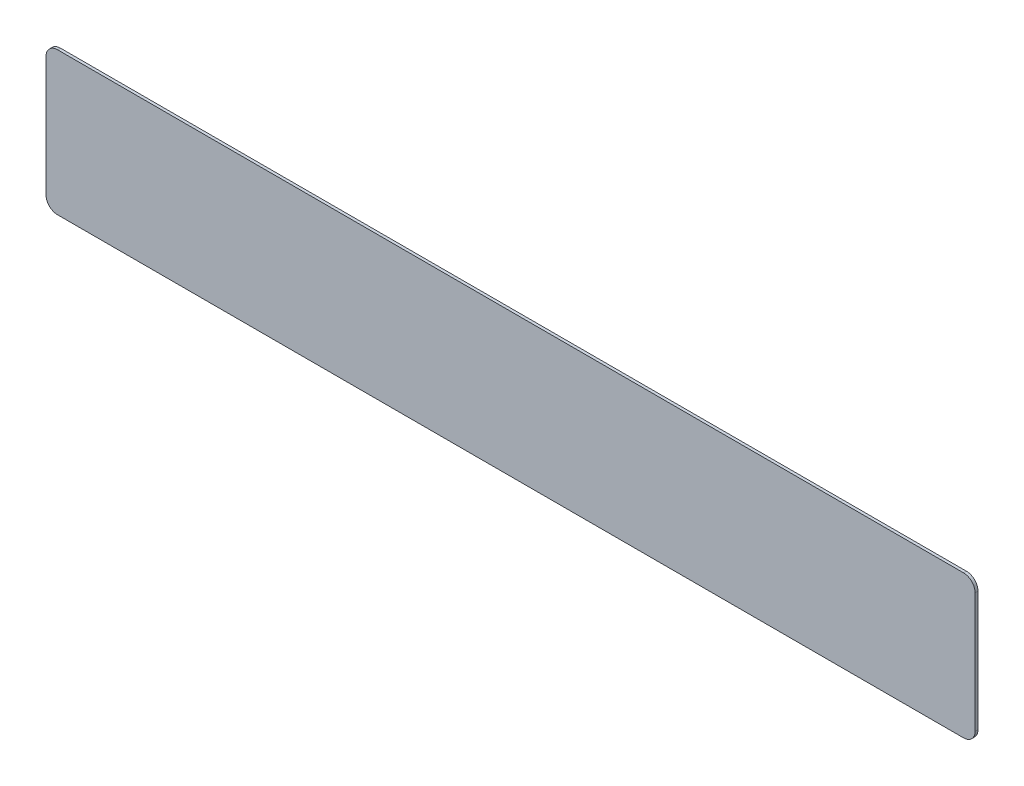
ISO-10303-21;
HEADER;
FILE_DESCRIPTION(('STEP AP214'),'2;1');
FILE_NAME('part.step','',(''),(''),'','','');
FILE_SCHEMA(('AUTOMOTIVE_DESIGN { 1 0 10303 214 1 1 1 1 }'));
ENDSEC;
DATA;
#1=APPLICATION_CONTEXT('core data for automotive mechanical design processes');
#2=APPLICATION_PROTOCOL_DEFINITION('international standard','automotive_design',2000,#1);
#3=PRODUCT_CONTEXT('',#1,'mechanical');
#4=PRODUCT('Part','Part','',(#3));
#5=PRODUCT_RELATED_PRODUCT_CATEGORY('part','',(#4));
#6=PRODUCT_DEFINITION_FORMATION('','',#4);
#7=PRODUCT_DEFINITION_CONTEXT('part definition',#1,'design');
#8=PRODUCT_DEFINITION('design','',#6,#7);
#9=PRODUCT_DEFINITION_SHAPE('','',#8);
#10=(LENGTH_UNIT() NAMED_UNIT(*) SI_UNIT(.MILLI.,.METRE.));
#11=(NAMED_UNIT(*) PLANE_ANGLE_UNIT() SI_UNIT($,.RADIAN.));
#12=(NAMED_UNIT(*) SI_UNIT($,.STERADIAN.) SOLID_ANGLE_UNIT());
#13=UNCERTAINTY_MEASURE_WITH_UNIT(LENGTH_MEASURE(1.E-05),#10,'distance_accuracy_value','');
#14=(GEOMETRIC_REPRESENTATION_CONTEXT(3) GLOBAL_UNCERTAINTY_ASSIGNED_CONTEXT((#13)) GLOBAL_UNIT_ASSIGNED_CONTEXT((#10,
#11,#12)) REPRESENTATION_CONTEXT('',''));
#15=CARTESIAN_POINT('',(0.,0.,0.));
#16=DIRECTION('',(0.,0.,1.));
#17=DIRECTION('',(1.,0.,0.));
#18=AXIS2_PLACEMENT_3D('',#15,#16,#17);
#19=CARTESIAN_POINT('',(316.901308233038,-41.9013082330377,2.));
#20=DIRECTION('',(0.,0.,-1.));
#21=DIRECTION('',(-1.,0.,0.));
#22=AXIS2_PLACEMENT_3D('',#19,#20,#21);
#23=CYLINDRICAL_SURFACE('',#22,8.09869176696232);
#24=CARTESIAN_POINT('',(316.901308233038,-41.9013082330377,0.));
#25=DIRECTION('',(0.,0.,1.));
#26=DIRECTION('',(1.,0.,0.));
#27=AXIS2_PLACEMENT_3D('',#24,#25,#26);
#28=CIRCLE('',#27,8.09869176696232);
#29=CARTESIAN_POINT('',(316.901308233038,-50.,0.));
#30=VERTEX_POINT('',#29);
#31=CARTESIAN_POINT('',(325.,-41.9013082330377,0.));
#32=VERTEX_POINT('',#31);
#33=EDGE_CURVE('E128',#30,#32,#28,.T.);
#34=ORIENTED_EDGE('',*,*,#33,.T.);
#35=DIRECTION('',(0.,0.,-1.));
#36=VECTOR('',#35,1.);
#37=CARTESIAN_POINT('',(325.,-41.9013082330377,2.));
#38=LINE('',#37,#36);
#39=CARTESIAN_POINT('',(325.,-41.9013082330377,2.));
#40=VERTEX_POINT('',#39);
#41=EDGE_CURVE('E11',#40,#32,#38,.T.);
#42=ORIENTED_EDGE('',*,*,#41,.F.);
#43=CARTESIAN_POINT('',(316.901308233038,-41.9013082330377,2.));
#44=DIRECTION('',(0.,0.,1.));
#45=DIRECTION('',(1.,0.,0.));
#46=AXIS2_PLACEMENT_3D('',#43,#44,#45);
#47=CIRCLE('',#46,8.09869176696232);
#48=CARTESIAN_POINT('',(316.901308233038,-50.,2.));
#49=VERTEX_POINT('',#48);
#50=EDGE_CURVE('E142',#49,#40,#47,.T.);
#51=ORIENTED_EDGE('',*,*,#50,.F.);
#52=DIRECTION('',(0.,0.,-1.));
#53=VECTOR('',#52,1.);
#54=CARTESIAN_POINT('',(316.901308233038,-50.,2.));
#55=LINE('',#54,#53);
#56=EDGE_CURVE('E124',#49,#30,#55,.T.);
#57=ORIENTED_EDGE('',*,*,#56,.T.);
#58=EDGE_LOOP('',(#34,#42,#51,#57));
#59=FACE_BOUND('',#58,.T.);
#60=ADVANCED_FACE('F32',(#59),#23,.T.);
#61=CARTESIAN_POINT('',(325.,-41.9013082330377,2.));
#62=DIRECTION('',(-1.,0.,0.));
#63=DIRECTION('',(0.,0.,1.));
#64=AXIS2_PLACEMENT_3D('',#61,#62,#63);
#65=PLANE('',#64);
#66=DIRECTION('',(0.,1.,0.));
#67=VECTOR('',#66,1.);
#68=CARTESIAN_POINT('',(325.,-41.9013082330377,0.));
#69=LINE('',#68,#67);
#70=CARTESIAN_POINT('',(325.,41.9013082330377,0.));
#71=VERTEX_POINT('',#70);
#72=EDGE_CURVE('E131',#32,#71,#69,.T.);
#73=ORIENTED_EDGE('',*,*,#72,.T.);
#74=DIRECTION('',(0.,0.,-1.));
#75=VECTOR('',#74,1.);
#76=CARTESIAN_POINT('',(325.,41.9013082330377,2.));
#77=LINE('',#76,#75);
#78=CARTESIAN_POINT('',(325.,41.9013082330377,2.));
#79=VERTEX_POINT('',#78);
#80=EDGE_CURVE('E40',#79,#71,#77,.T.);
#81=ORIENTED_EDGE('',*,*,#80,.F.);
#82=DIRECTION('',(0.,1.,0.));
#83=VECTOR('',#82,1.);
#84=CARTESIAN_POINT('',(325.,-41.9013082330377,2.));
#85=LINE('',#84,#83);
#86=EDGE_CURVE('E91',#40,#79,#85,.T.);
#87=ORIENTED_EDGE('',*,*,#86,.F.);
#88=ORIENTED_EDGE('',*,*,#41,.T.);
#89=EDGE_LOOP('',(#73,#81,#87,#88));
#90=FACE_BOUND('',#89,.T.);
#91=ADVANCED_FACE('F177',(#90),#65,.F.);
#92=CARTESIAN_POINT('',(316.901308233038,41.9013082330377,2.));
#93=DIRECTION('',(0.,0.,-1.));
#94=DIRECTION('',(-1.,0.,0.));
#95=AXIS2_PLACEMENT_3D('',#92,#93,#94);
#96=CYLINDRICAL_SURFACE('',#95,8.09869176696232);
#97=CARTESIAN_POINT('',(316.901308233038,41.9013082330377,0.));
#98=DIRECTION('',(0.,0.,1.));
#99=DIRECTION('',(1.,0.,0.));
#100=AXIS2_PLACEMENT_3D('',#97,#98,#99);
#101=CIRCLE('',#100,8.09869176696232);
#102=CARTESIAN_POINT('',(316.901308233038,50.,0.));
#103=VERTEX_POINT('',#102);
#104=EDGE_CURVE('E133',#71,#103,#101,.T.);
#105=ORIENTED_EDGE('',*,*,#104,.T.);
#106=DIRECTION('',(0.,0.,-1.));
#107=VECTOR('',#106,1.);
#108=CARTESIAN_POINT('',(316.901308233038,50.,2.));
#109=LINE('',#108,#107);
#110=CARTESIAN_POINT('',(316.901308233038,50.,2.));
#111=VERTEX_POINT('',#110);
#112=EDGE_CURVE('E149',#111,#103,#109,.T.);
#113=ORIENTED_EDGE('',*,*,#112,.F.);
#114=CARTESIAN_POINT('',(316.901308233038,41.9013082330377,2.));
#115=DIRECTION('',(0.,0.,1.));
#116=DIRECTION('',(1.,0.,0.));
#117=AXIS2_PLACEMENT_3D('',#114,#115,#116);
#118=CIRCLE('',#117,8.09869176696232);
#119=EDGE_CURVE('E157',#79,#111,#118,.T.);
#120=ORIENTED_EDGE('',*,*,#119,.F.);
#121=ORIENTED_EDGE('',*,*,#80,.T.);
#122=EDGE_LOOP('',(#105,#113,#120,#121));
#123=FACE_BOUND('',#122,.T.);
#124=ADVANCED_FACE('F155',(#123),#96,.T.);
#125=CARTESIAN_POINT('',(-316.901308233038,50.,2.));
#126=DIRECTION('',(0.,-1.,0.));
#127=DIRECTION('',(0.,0.,-1.));
#128=AXIS2_PLACEMENT_3D('',#125,#126,#127);
#129=PLANE('',#128);
#130=DIRECTION('',(-1.,0.,0.));
#131=VECTOR('',#130,1.);
#132=CARTESIAN_POINT('',(-316.901308233038,50.,0.));
#133=LINE('',#132,#131);
#134=CARTESIAN_POINT('',(-316.901308233038,50.,0.));
#135=VERTEX_POINT('',#134);
#136=EDGE_CURVE('E135',#103,#135,#133,.T.);
#137=ORIENTED_EDGE('',*,*,#136,.T.);
#138=DIRECTION('',(0.,0.,-1.));
#139=VECTOR('',#138,1.);
#140=CARTESIAN_POINT('',(-316.901308233038,50.,2.));
#141=LINE('',#140,#139);
#142=CARTESIAN_POINT('',(-316.901308233038,50.,2.));
#143=VERTEX_POINT('',#142);
#144=EDGE_CURVE('E146',#143,#135,#141,.T.);
#145=ORIENTED_EDGE('',*,*,#144,.F.);
#146=DIRECTION('',(-1.,0.,0.));
#147=VECTOR('',#146,1.);
#148=CARTESIAN_POINT('',(-316.901308233038,50.,2.));
#149=LINE('',#148,#147);
#150=EDGE_CURVE('E169',#111,#143,#149,.T.);
#151=ORIENTED_EDGE('',*,*,#150,.F.);
#152=ORIENTED_EDGE('',*,*,#112,.T.);
#153=EDGE_LOOP('',(#137,#145,#151,#152));
#154=FACE_BOUND('',#153,.T.);
#155=ADVANCED_FACE('F165',(#154),#129,.F.);
#156=CARTESIAN_POINT('',(-316.901308233038,41.9013082330377,2.));
#157=DIRECTION('',(0.,0.,-1.));
#158=DIRECTION('',(-1.,0.,0.));
#159=AXIS2_PLACEMENT_3D('',#156,#157,#158);
#160=CYLINDRICAL_SURFACE('',#159,8.09869176696232);
#161=CARTESIAN_POINT('',(-316.901308233038,41.9013082330377,0.));
#162=DIRECTION('',(0.,0.,1.));
#163=DIRECTION('',(-1.,0.,0.));
#164=AXIS2_PLACEMENT_3D('',#161,#162,#163);
#165=CIRCLE('',#164,8.09869176696232);
#166=CARTESIAN_POINT('',(-325.,41.9013082330377,0.));
#167=VERTEX_POINT('',#166);
#168=EDGE_CURVE('E137',#135,#167,#165,.T.);
#169=ORIENTED_EDGE('',*,*,#168,.T.);
#170=DIRECTION('',(0.,0.,-1.));
#171=VECTOR('',#170,1.);
#172=CARTESIAN_POINT('',(-325.,41.9013082330377,2.));
#173=LINE('',#172,#171);
#174=CARTESIAN_POINT('',(-325.,41.9013082330377,2.));
#175=VERTEX_POINT('',#174);
#176=EDGE_CURVE('E119',#175,#167,#173,.T.);
#177=ORIENTED_EDGE('',*,*,#176,.F.);
#178=CARTESIAN_POINT('',(-316.901308233038,41.9013082330377,2.));
#179=DIRECTION('',(0.,0.,1.));
#180=DIRECTION('',(-1.,0.,0.));
#181=AXIS2_PLACEMENT_3D('',#178,#179,#180);
#182=CIRCLE('',#181,8.09869176696232);
#183=EDGE_CURVE('E110',#143,#175,#182,.T.);
#184=ORIENTED_EDGE('',*,*,#183,.F.);
#185=ORIENTED_EDGE('',*,*,#144,.T.);
#186=EDGE_LOOP('',(#169,#177,#184,#185));
#187=FACE_BOUND('',#186,.T.);
#188=ADVANCED_FACE('F168',(#187),#160,.T.);
#189=CARTESIAN_POINT('',(-325.,-41.9013082330377,2.));
#190=DIRECTION('',(1.,0.,0.));
#191=DIRECTION('',(0.,0.,-1.));
#192=AXIS2_PLACEMENT_3D('',#189,#190,#191);
#193=PLANE('',#192);
#194=DIRECTION('',(0.,-1.,0.));
#195=VECTOR('',#194,1.);
#196=CARTESIAN_POINT('',(-325.,-41.9013082330377,0.));
#197=LINE('',#196,#195);
#198=CARTESIAN_POINT('',(-325.,-41.9013082330377,0.));
#199=VERTEX_POINT('',#198);
#200=EDGE_CURVE('E118',#167,#199,#197,.T.);
#201=ORIENTED_EDGE('',*,*,#200,.T.);
#202=DIRECTION('',(0.,0.,-1.));
#203=VECTOR('',#202,1.);
#204=CARTESIAN_POINT('',(-325.,-41.9013082330377,2.));
#205=LINE('',#204,#203);
#206=CARTESIAN_POINT('',(-325.,-41.9013082330377,2.));
#207=VERTEX_POINT('',#206);
#208=EDGE_CURVE('E115',#207,#199,#205,.T.);
#209=ORIENTED_EDGE('',*,*,#208,.F.);
#210=DIRECTION('',(0.,-1.,0.));
#211=VECTOR('',#210,1.);
#212=CARTESIAN_POINT('',(-325.,-41.9013082330377,2.));
#213=LINE('',#212,#211);
#214=EDGE_CURVE('E104',#175,#207,#213,.T.);
#215=ORIENTED_EDGE('',*,*,#214,.F.);
#216=ORIENTED_EDGE('',*,*,#176,.T.);
#217=EDGE_LOOP('',(#201,#209,#215,#216));
#218=FACE_BOUND('',#217,.T.);
#219=ADVANCED_FACE('F116',(#218),#193,.F.);
#220=CARTESIAN_POINT('',(-316.901308233038,-41.9013082330377,2.));
#221=DIRECTION('',(0.,0.,-1.));
#222=DIRECTION('',(-1.,0.,0.));
#223=AXIS2_PLACEMENT_3D('',#220,#221,#222);
#224=CYLINDRICAL_SURFACE('',#223,8.09869176696232);
#225=CARTESIAN_POINT('',(-316.901308233038,-41.9013082330377,0.));
#226=DIRECTION('',(0.,0.,1.));
#227=DIRECTION('',(-1.,0.,0.));
#228=AXIS2_PLACEMENT_3D('',#225,#226,#227);
#229=CIRCLE('',#228,8.09869176696232);
#230=CARTESIAN_POINT('',(-316.901308233038,-50.,0.));
#231=VERTEX_POINT('',#230);
#232=EDGE_CURVE('E77',#199,#231,#229,.T.);
#233=ORIENTED_EDGE('',*,*,#232,.T.);
#234=DIRECTION('',(0.,0.,-1.));
#235=VECTOR('',#234,1.);
#236=CARTESIAN_POINT('',(-316.901308233038,-50.,2.));
#237=LINE('',#236,#235);
#238=CARTESIAN_POINT('',(-316.901308233038,-50.,2.));
#239=VERTEX_POINT('',#238);
#240=EDGE_CURVE('E120',#239,#231,#237,.T.);
#241=ORIENTED_EDGE('',*,*,#240,.F.);
#242=CARTESIAN_POINT('',(-316.901308233038,-41.9013082330377,2.));
#243=DIRECTION('',(0.,0.,1.));
#244=DIRECTION('',(-1.,0.,0.));
#245=AXIS2_PLACEMENT_3D('',#242,#243,#244);
#246=CIRCLE('',#245,8.09869176696232);
#247=EDGE_CURVE('E108',#207,#239,#246,.T.);
#248=ORIENTED_EDGE('',*,*,#247,.F.);
#249=ORIENTED_EDGE('',*,*,#208,.T.);
#250=EDGE_LOOP('',(#233,#241,#248,#249));
#251=FACE_BOUND('',#250,.T.);
#252=ADVANCED_FACE('F122',(#251),#224,.T.);
#253=CARTESIAN_POINT('',(-316.901308233038,-50.,2.));
#254=DIRECTION('',(0.,1.,0.));
#255=DIRECTION('',(0.,0.,1.));
#256=AXIS2_PLACEMENT_3D('',#253,#254,#255);
#257=PLANE('',#256);
#258=DIRECTION('',(1.,0.,0.));
#259=VECTOR('',#258,1.);
#260=CARTESIAN_POINT('',(-316.901308233038,-50.,0.));
#261=LINE('',#260,#259);
#262=EDGE_CURVE('E83',#231,#30,#261,.T.);
#263=ORIENTED_EDGE('',*,*,#262,.T.);
#264=ORIENTED_EDGE('',*,*,#56,.F.);
#265=DIRECTION('',(1.,0.,0.));
#266=VECTOR('',#265,1.);
#267=CARTESIAN_POINT('',(-316.901308233038,-50.,2.));
#268=LINE('',#267,#266);
#269=EDGE_CURVE('E48',#239,#49,#268,.T.);
#270=ORIENTED_EDGE('',*,*,#269,.F.);
#271=ORIENTED_EDGE('',*,*,#240,.T.);
#272=EDGE_LOOP('',(#263,#264,#270,#271));
#273=FACE_BOUND('',#272,.T.);
#274=ADVANCED_FACE('F193',(#273),#257,.F.);
#275=CARTESIAN_POINT('',(316.901308233038,-41.9013082330377,2.));
#276=DIRECTION('',(0.,0.,1.));
#277=DIRECTION('',(1.,0.,0.));
#278=AXIS2_PLACEMENT_3D('',#275,#276,#277);
#279=PLANE('',#278);
#280=ORIENTED_EDGE('',*,*,#50,.T.);
#281=ORIENTED_EDGE('',*,*,#86,.T.);
#282=ORIENTED_EDGE('',*,*,#119,.T.);
#283=ORIENTED_EDGE('',*,*,#150,.T.);
#284=ORIENTED_EDGE('',*,*,#183,.T.);
#285=ORIENTED_EDGE('',*,*,#214,.T.);
#286=ORIENTED_EDGE('',*,*,#247,.T.);
#287=ORIENTED_EDGE('',*,*,#269,.T.);
#288=EDGE_LOOP('',(#280,#281,#282,#283,#284,#285,#286,#287));
#289=FACE_BOUND('',#288,.T.);
#290=ADVANCED_FACE('F106',(#289),#279,.T.);
#291=CARTESIAN_POINT('',(316.901308233038,-41.9013082330377,0.));
#292=DIRECTION('',(0.,0.,1.));
#293=DIRECTION('',(1.,0.,0.));
#294=AXIS2_PLACEMENT_3D('',#291,#292,#293);
#295=PLANE('',#294);
#296=ORIENTED_EDGE('',*,*,#33,.F.);
#297=ORIENTED_EDGE('',*,*,#262,.F.);
#298=ORIENTED_EDGE('',*,*,#232,.F.);
#299=ORIENTED_EDGE('',*,*,#200,.F.);
#300=ORIENTED_EDGE('',*,*,#168,.F.);
#301=ORIENTED_EDGE('',*,*,#136,.F.);
#302=ORIENTED_EDGE('',*,*,#104,.F.);
#303=ORIENTED_EDGE('',*,*,#72,.F.);
#304=EDGE_LOOP('',(#296,#297,#298,#299,#300,#301,#302,#303));
#305=FACE_BOUND('',#304,.T.);
#306=ADVANCED_FACE('F161',(#305),#295,.F.);
#307=CLOSED_SHELL('',(#60,#91,#124,#155,#188,#219,#252,#274,#290,#306));
#308=MANIFOLD_SOLID_BREP('B2',#307);
#309=ADVANCED_BREP_SHAPE_REPRESENTATION('',(#18,#308),#14);
#310=SHAPE_DEFINITION_REPRESENTATION(#9,#309);
ENDSEC;
END-ISO-10303-21;
